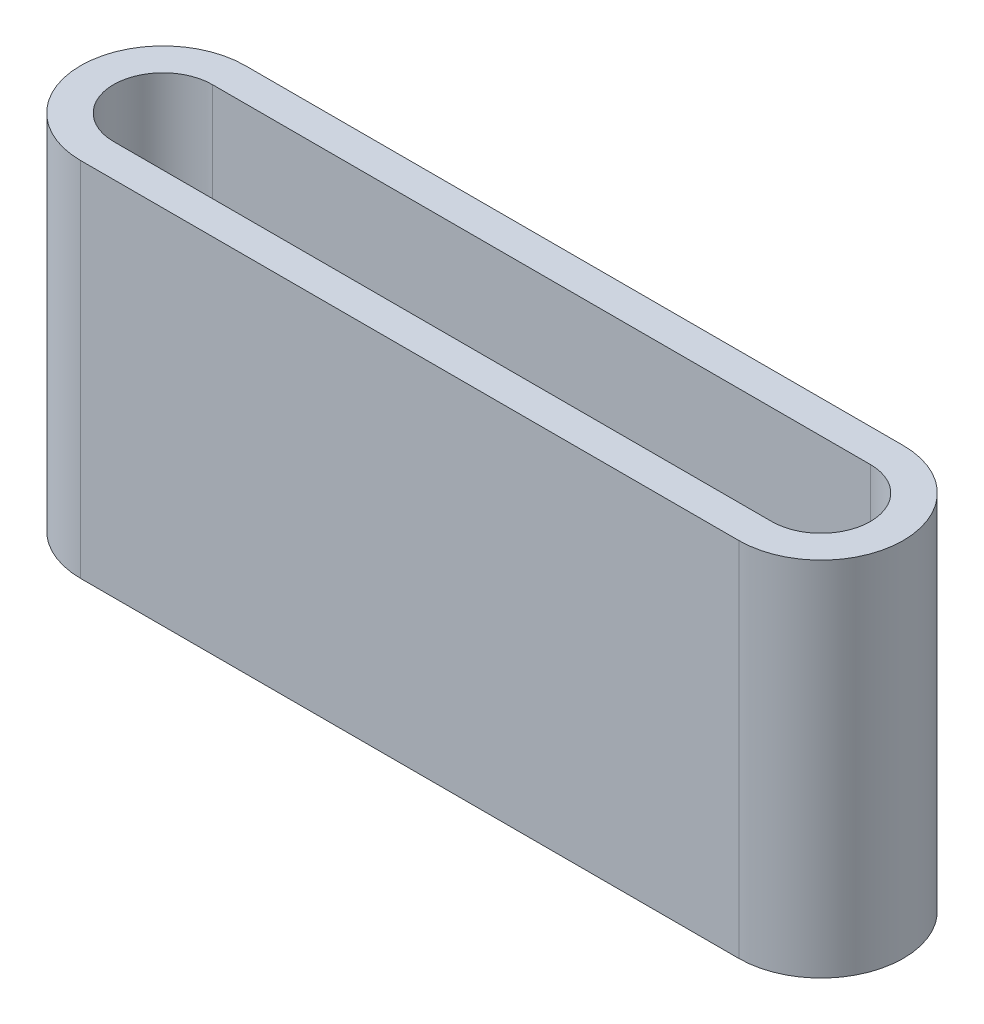
ISO-10303-21;
HEADER;
FILE_DESCRIPTION(('STEP AP214'),'2;1');
FILE_NAME('part.step','',(''),(''),'','','');
FILE_SCHEMA(('AUTOMOTIVE_DESIGN { 1 0 10303 214 1 1 1 1 }'));
ENDSEC;
DATA;
#1=APPLICATION_CONTEXT('core data for automotive mechanical design processes');
#2=APPLICATION_PROTOCOL_DEFINITION('international standard','automotive_design',2000,#1);
#3=PRODUCT_CONTEXT('',#1,'mechanical');
#4=PRODUCT('Part','Part','',(#3));
#5=PRODUCT_RELATED_PRODUCT_CATEGORY('part','',(#4));
#6=PRODUCT_DEFINITION_FORMATION('','',#4);
#7=PRODUCT_DEFINITION_CONTEXT('part definition',#1,'design');
#8=PRODUCT_DEFINITION('design','',#6,#7);
#9=PRODUCT_DEFINITION_SHAPE('','',#8);
#10=(LENGTH_UNIT() NAMED_UNIT(*) SI_UNIT(.MILLI.,.METRE.));
#11=(NAMED_UNIT(*) PLANE_ANGLE_UNIT() SI_UNIT($,.RADIAN.));
#12=(NAMED_UNIT(*) SI_UNIT($,.STERADIAN.) SOLID_ANGLE_UNIT());
#13=UNCERTAINTY_MEASURE_WITH_UNIT(LENGTH_MEASURE(1.E-05),#10,'distance_accuracy_value','');
#14=(GEOMETRIC_REPRESENTATION_CONTEXT(3) GLOBAL_UNCERTAINTY_ASSIGNED_CONTEXT((#13)) GLOBAL_UNIT_ASSIGNED_CONTEXT((#10,
#11,#12)) REPRESENTATION_CONTEXT('',''));
#15=CARTESIAN_POINT('',(0.,0.,0.));
#16=DIRECTION('',(0.,0.,1.));
#17=DIRECTION('',(1.,0.,0.));
#18=AXIS2_PLACEMENT_3D('',#15,#16,#17);
#19=CARTESIAN_POINT('',(0.,20.,0.));
#20=DIRECTION('',(0.,-1.,0.));
#21=DIRECTION('',(0.,0.,-1.));
#22=AXIS2_PLACEMENT_3D('',#19,#20,#21);
#23=CYLINDRICAL_SURFACE('',#22,12.5);
#24=CARTESIAN_POINT('',(0.,0.,0.));
#25=DIRECTION('',(0.,1.,0.));
#26=DIRECTION('',(0.,0.,1.));
#27=AXIS2_PLACEMENT_3D('',#24,#25,#26);
#28=CIRCLE('',#27,12.5);
#29=CARTESIAN_POINT('',(0.,0.,-12.5));
#30=VERTEX_POINT('',#29);
#31=CARTESIAN_POINT('',(0.,0.,12.5));
#32=VERTEX_POINT('',#31);
#33=EDGE_CURVE('E183',#30,#32,#28,.T.);
#34=ORIENTED_EDGE('',*,*,#33,.T.);
#35=DIRECTION('',(0.,-1.,0.));
#36=VECTOR('',#35,1.);
#37=CARTESIAN_POINT('',(0.,20.,12.5));
#38=LINE('',#37,#36);
#39=CARTESIAN_POINT('',(0.,55.,12.5));
#40=VERTEX_POINT('',#39);
#41=EDGE_CURVE('E12',#40,#32,#38,.T.);
#42=ORIENTED_EDGE('',*,*,#41,.F.);
#43=CARTESIAN_POINT('',(0.,55.,0.));
#44=DIRECTION('',(0.,-1.,0.));
#45=DIRECTION('',(0.,0.,-1.));
#46=AXIS2_PLACEMENT_3D('',#43,#44,#45);
#47=CIRCLE('',#46,12.5);
#48=CARTESIAN_POINT('',(0.,55.,-12.5));
#49=VERTEX_POINT('',#48);
#50=EDGE_CURVE('E158',#40,#49,#47,.T.);
#51=ORIENTED_EDGE('',*,*,#50,.T.);
#52=DIRECTION('',(0.,-1.,0.));
#53=VECTOR('',#52,1.);
#54=CARTESIAN_POINT('',(0.,20.,-12.5));
#55=LINE('',#54,#53);
#56=EDGE_CURVE('E191',#49,#30,#55,.T.);
#57=ORIENTED_EDGE('',*,*,#56,.T.);
#58=EDGE_LOOP('',(#34,#42,#51,#57));
#59=FACE_BOUND('',#58,.T.);
#60=ADVANCED_FACE('F65',(#59),#23,.T.);
#61=CARTESIAN_POINT('',(0.,20.,12.5));
#62=DIRECTION('',(0.,0.,-1.));
#63=DIRECTION('',(-1.,0.,0.));
#64=AXIS2_PLACEMENT_3D('',#61,#62,#63);
#65=PLANE('',#64);
#66=DIRECTION('',(1.,0.,0.));
#67=VECTOR('',#66,1.);
#68=CARTESIAN_POINT('',(0.,0.,12.5));
#69=LINE('',#68,#67);
#70=CARTESIAN_POINT('',(100.,0.,12.5));
#71=VERTEX_POINT('',#70);
#72=EDGE_CURVE('E186',#32,#71,#69,.T.);
#73=ORIENTED_EDGE('',*,*,#72,.T.);
#74=DIRECTION('',(0.,-1.,0.));
#75=VECTOR('',#74,1.);
#76=CARTESIAN_POINT('',(100.,20.,12.5));
#77=LINE('',#76,#75);
#78=CARTESIAN_POINT('',(100.,55.,12.5));
#79=VERTEX_POINT('',#78);
#80=EDGE_CURVE('E72',#79,#71,#77,.T.);
#81=ORIENTED_EDGE('',*,*,#80,.F.);
#82=DIRECTION('',(-1.,0.,0.));
#83=VECTOR('',#82,1.);
#84=CARTESIAN_POINT('',(100.,55.,12.5));
#85=LINE('',#84,#83);
#86=EDGE_CURVE('E171',#79,#40,#85,.T.);
#87=ORIENTED_EDGE('',*,*,#86,.T.);
#88=ORIENTED_EDGE('',*,*,#41,.T.);
#89=EDGE_LOOP('',(#73,#81,#87,#88));
#90=FACE_BOUND('',#89,.T.);
#91=ADVANCED_FACE('F208',(#90),#65,.F.);
#92=CARTESIAN_POINT('',(100.,20.,0.));
#93=DIRECTION('',(0.,-1.,0.));
#94=DIRECTION('',(0.,0.,-1.));
#95=AXIS2_PLACEMENT_3D('',#92,#93,#94);
#96=CYLINDRICAL_SURFACE('',#95,12.5);
#97=CARTESIAN_POINT('',(100.,0.,0.));
#98=DIRECTION('',(0.,1.,0.));
#99=DIRECTION('',(0.,0.,1.));
#100=AXIS2_PLACEMENT_3D('',#97,#98,#99);
#101=CIRCLE('',#100,12.5);
#102=CARTESIAN_POINT('',(100.,0.,-12.5));
#103=VERTEX_POINT('',#102);
#104=EDGE_CURVE('E188',#71,#103,#101,.T.);
#105=ORIENTED_EDGE('',*,*,#104,.T.);
#106=DIRECTION('',(0.,-1.,0.));
#107=VECTOR('',#106,1.);
#108=CARTESIAN_POINT('',(100.,20.,-12.5));
#109=LINE('',#108,#107);
#110=CARTESIAN_POINT('',(100.,55.,-12.5));
#111=VERTEX_POINT('',#110);
#112=EDGE_CURVE('E193',#111,#103,#109,.T.);
#113=ORIENTED_EDGE('',*,*,#112,.F.);
#114=CARTESIAN_POINT('',(100.,55.,0.));
#115=DIRECTION('',(0.,-1.,0.));
#116=DIRECTION('',(0.,0.,-1.));
#117=AXIS2_PLACEMENT_3D('',#114,#115,#116);
#118=CIRCLE('',#117,12.5);
#119=EDGE_CURVE('E168',#111,#79,#118,.T.);
#120=ORIENTED_EDGE('',*,*,#119,.T.);
#121=ORIENTED_EDGE('',*,*,#80,.T.);
#122=EDGE_LOOP('',(#105,#113,#120,#121));
#123=FACE_BOUND('',#122,.T.);
#124=ADVANCED_FACE('F197',(#123),#96,.T.);
#125=CARTESIAN_POINT('',(0.,20.,-12.5));
#126=DIRECTION('',(0.,0.,1.));
#127=DIRECTION('',(1.,0.,0.));
#128=AXIS2_PLACEMENT_3D('',#125,#126,#127);
#129=PLANE('',#128);
#130=DIRECTION('',(-1.,0.,0.));
#131=VECTOR('',#130,1.);
#132=CARTESIAN_POINT('',(0.,0.,-12.5));
#133=LINE('',#132,#131);
#134=EDGE_CURVE('E87',#103,#30,#133,.T.);
#135=ORIENTED_EDGE('',*,*,#134,.T.);
#136=ORIENTED_EDGE('',*,*,#56,.F.);
#137=DIRECTION('',(1.,0.,0.));
#138=VECTOR('',#137,1.);
#139=CARTESIAN_POINT('',(0.,55.,-12.5));
#140=LINE('',#139,#138);
#141=EDGE_CURVE('E165',#49,#111,#140,.T.);
#142=ORIENTED_EDGE('',*,*,#141,.T.);
#143=ORIENTED_EDGE('',*,*,#112,.T.);
#144=EDGE_LOOP('',(#135,#136,#142,#143));
#145=FACE_BOUND('',#144,.T.);
#146=ADVANCED_FACE('F207',(#145),#129,.F.);
#147=CARTESIAN_POINT('',(0.,0.,0.));
#148=DIRECTION('',(0.,1.,0.));
#149=DIRECTION('',(0.,0.,1.));
#150=AXIS2_PLACEMENT_3D('',#147,#148,#149);
#151=PLANE('',#150);
#152=ORIENTED_EDGE('',*,*,#33,.F.);
#153=ORIENTED_EDGE('',*,*,#134,.F.);
#154=ORIENTED_EDGE('',*,*,#104,.F.);
#155=ORIENTED_EDGE('',*,*,#72,.F.);
#156=EDGE_LOOP('',(#152,#153,#154,#155));
#157=FACE_BOUND('',#156,.T.);
#158=ADVANCED_FACE('F203',(#157),#151,.F.);
#159=CARTESIAN_POINT('',(0.,55.,0.));
#160=DIRECTION('',(0.,-1.,0.));
#161=DIRECTION('',(0.,0.,-1.));
#162=AXIS2_PLACEMENT_3D('',#159,#160,#161);
#163=PLANE('',#162);
#164=DIRECTION('',(-1.,0.,0.));
#165=VECTOR('',#164,1.);
#166=CARTESIAN_POINT('',(100.,55.,7.5));
#167=LINE('',#166,#165);
#168=CARTESIAN_POINT('',(100.,55.,7.5));
#169=VERTEX_POINT('',#168);
#170=CARTESIAN_POINT('',(0.,55.,7.5));
#171=VERTEX_POINT('',#170);
#172=EDGE_CURVE('E138',#169,#171,#167,.T.);
#173=ORIENTED_EDGE('',*,*,#172,.T.);
#174=CARTESIAN_POINT('',(0.,55.,0.));
#175=DIRECTION('',(0.,-1.,0.));
#176=DIRECTION('',(1.,0.,0.));
#177=AXIS2_PLACEMENT_3D('',#174,#175,#176);
#178=CIRCLE('',#177,7.5);
#179=CARTESIAN_POINT('',(0.,55.,-7.5));
#180=VERTEX_POINT('',#179);
#181=EDGE_CURVE('E132',#171,#180,#178,.T.);
#182=ORIENTED_EDGE('',*,*,#181,.T.);
#183=DIRECTION('',(1.,0.,0.));
#184=VECTOR('',#183,1.);
#185=CARTESIAN_POINT('',(0.,55.,-7.5));
#186=LINE('',#185,#184);
#187=CARTESIAN_POINT('',(100.,55.,-7.5));
#188=VERTEX_POINT('',#187);
#189=EDGE_CURVE('E142',#180,#188,#186,.T.);
#190=ORIENTED_EDGE('',*,*,#189,.T.);
#191=CARTESIAN_POINT('',(100.,55.,0.));
#192=DIRECTION('',(0.,-1.,0.));
#193=DIRECTION('',(1.,0.,0.));
#194=AXIS2_PLACEMENT_3D('',#191,#192,#193);
#195=CIRCLE('',#194,7.5);
#196=EDGE_CURVE('E147',#188,#169,#195,.T.);
#197=ORIENTED_EDGE('',*,*,#196,.T.);
#198=EDGE_LOOP('',(#173,#182,#190,#197));
#199=FACE_BOUND('',#198,.T.);
#200=ORIENTED_EDGE('',*,*,#50,.F.);
#201=ORIENTED_EDGE('',*,*,#86,.F.);
#202=ORIENTED_EDGE('',*,*,#119,.F.);
#203=ORIENTED_EDGE('',*,*,#141,.F.);
#204=EDGE_LOOP('',(#200,#201,#202,#203));
#205=FACE_BOUND('',#204,.T.);
#206=ADVANCED_FACE('F149',(#199,#205),#163,.F.);
#207=CARTESIAN_POINT('',(0.,55.,0.));
#208=DIRECTION('',(0.,-1.,0.));
#209=DIRECTION('',(0.,0.,-1.));
#210=AXIS2_PLACEMENT_3D('',#207,#208,#209);
#211=CYLINDRICAL_SURFACE('',#210,7.5);
#212=CARTESIAN_POINT('',(0.,20.,0.));
#213=DIRECTION('',(0.,1.,0.));
#214=DIRECTION('',(0.,0.,1.));
#215=AXIS2_PLACEMENT_3D('',#212,#213,#214);
#216=CIRCLE('',#215,7.5);
#217=CARTESIAN_POINT('',(0.,20.,-7.5));
#218=VERTEX_POINT('',#217);
#219=CARTESIAN_POINT('',(0.,20.,7.5));
#220=VERTEX_POINT('',#219);
#221=EDGE_CURVE('E135',#218,#220,#216,.T.);
#222=ORIENTED_EDGE('',*,*,#221,.F.);
#223=DIRECTION('',(0.,-1.,0.));
#224=VECTOR('',#223,1.);
#225=CARTESIAN_POINT('',(0.,55.,-7.5));
#226=LINE('',#225,#224);
#227=EDGE_CURVE('E79',#180,#218,#226,.T.);
#228=ORIENTED_EDGE('',*,*,#227,.F.);
#229=ORIENTED_EDGE('',*,*,#181,.F.);
#230=DIRECTION('',(0.,-1.,0.));
#231=VECTOR('',#230,1.);
#232=CARTESIAN_POINT('',(0.,55.,7.5));
#233=LINE('',#232,#231);
#234=EDGE_CURVE('E156',#171,#220,#233,.T.);
#235=ORIENTED_EDGE('',*,*,#234,.T.);
#236=EDGE_LOOP('',(#222,#228,#229,#235));
#237=FACE_BOUND('',#236,.T.);
#238=ADVANCED_FACE('F129',(#237),#211,.F.);
#239=CARTESIAN_POINT('',(100.,55.,7.5));
#240=DIRECTION('',(0.,0.,1.));
#241=DIRECTION('',(1.,0.,0.));
#242=AXIS2_PLACEMENT_3D('',#239,#240,#241);
#243=PLANE('',#242);
#244=DIRECTION('',(1.,0.,0.));
#245=VECTOR('',#244,1.);
#246=CARTESIAN_POINT('',(0.,20.,7.5));
#247=LINE('',#246,#245);
#248=CARTESIAN_POINT('',(100.,20.,7.5));
#249=VERTEX_POINT('',#248);
#250=EDGE_CURVE('E179',#220,#249,#247,.T.);
#251=ORIENTED_EDGE('',*,*,#250,.F.);
#252=ORIENTED_EDGE('',*,*,#234,.F.);
#253=ORIENTED_EDGE('',*,*,#172,.F.);
#254=DIRECTION('',(0.,-1.,0.));
#255=VECTOR('',#254,1.);
#256=CARTESIAN_POINT('',(100.,55.,7.5));
#257=LINE('',#256,#255);
#258=EDGE_CURVE('E159',#169,#249,#257,.T.);
#259=ORIENTED_EDGE('',*,*,#258,.T.);
#260=EDGE_LOOP('',(#251,#252,#253,#259));
#261=FACE_BOUND('',#260,.T.);
#262=ADVANCED_FACE('F228',(#261),#243,.F.);
#263=CARTESIAN_POINT('',(100.,55.,0.));
#264=DIRECTION('',(0.,-1.,0.));
#265=DIRECTION('',(0.,0.,-1.));
#266=AXIS2_PLACEMENT_3D('',#263,#264,#265);
#267=CYLINDRICAL_SURFACE('',#266,7.5);
#268=CARTESIAN_POINT('',(100.,20.,0.));
#269=DIRECTION('',(0.,1.,0.));
#270=DIRECTION('',(0.,0.,1.));
#271=AXIS2_PLACEMENT_3D('',#268,#269,#270);
#272=CIRCLE('',#271,7.5);
#273=CARTESIAN_POINT('',(100.,20.,-7.5));
#274=VERTEX_POINT('',#273);
#275=EDGE_CURVE('E176',#249,#274,#272,.T.);
#276=ORIENTED_EDGE('',*,*,#275,.F.);
#277=ORIENTED_EDGE('',*,*,#258,.F.);
#278=ORIENTED_EDGE('',*,*,#196,.F.);
#279=DIRECTION('',(0.,-1.,0.));
#280=VECTOR('',#279,1.);
#281=CARTESIAN_POINT('',(100.,55.,-7.5));
#282=LINE('',#281,#280);
#283=EDGE_CURVE('E137',#188,#274,#282,.T.);
#284=ORIENTED_EDGE('',*,*,#283,.T.);
#285=EDGE_LOOP('',(#276,#277,#278,#284));
#286=FACE_BOUND('',#285,.T.);
#287=ADVANCED_FACE('F231',(#286),#267,.F.);
#288=CARTESIAN_POINT('',(0.,55.,-7.5));
#289=DIRECTION('',(0.,0.,-1.));
#290=DIRECTION('',(-1.,0.,0.));
#291=AXIS2_PLACEMENT_3D('',#288,#289,#290);
#292=PLANE('',#291);
#293=DIRECTION('',(-1.,0.,0.));
#294=VECTOR('',#293,1.);
#295=CARTESIAN_POINT('',(0.,20.,-7.5));
#296=LINE('',#295,#294);
#297=EDGE_CURVE('E174',#274,#218,#296,.T.);
#298=ORIENTED_EDGE('',*,*,#297,.F.);
#299=ORIENTED_EDGE('',*,*,#283,.F.);
#300=ORIENTED_EDGE('',*,*,#189,.F.);
#301=ORIENTED_EDGE('',*,*,#227,.T.);
#302=EDGE_LOOP('',(#298,#299,#300,#301));
#303=FACE_BOUND('',#302,.T.);
#304=ADVANCED_FACE('F143',(#303),#292,.F.);
#305=CARTESIAN_POINT('',(0.,20.,0.));
#306=DIRECTION('',(0.,1.,0.));
#307=DIRECTION('',(0.,0.,1.));
#308=AXIS2_PLACEMENT_3D('',#305,#306,#307);
#309=PLANE('',#308);
#310=ORIENTED_EDGE('',*,*,#297,.T.);
#311=ORIENTED_EDGE('',*,*,#221,.T.);
#312=ORIENTED_EDGE('',*,*,#250,.T.);
#313=ORIENTED_EDGE('',*,*,#275,.T.);
#314=EDGE_LOOP('',(#310,#311,#312,#313));
#315=FACE_BOUND('',#314,.T.);
#316=ADVANCED_FACE('F220',(#315),#309,.T.);
#317=CLOSED_SHELL('',(#60,#91,#124,#146,#158,#206,#238,#262,#287,#304,#316));
#318=MANIFOLD_SOLID_BREP('B2',#317);
#319=ADVANCED_BREP_SHAPE_REPRESENTATION('',(#18,#318),#14);
#320=SHAPE_DEFINITION_REPRESENTATION(#9,#319);
ENDSEC;
END-ISO-10303-21;
